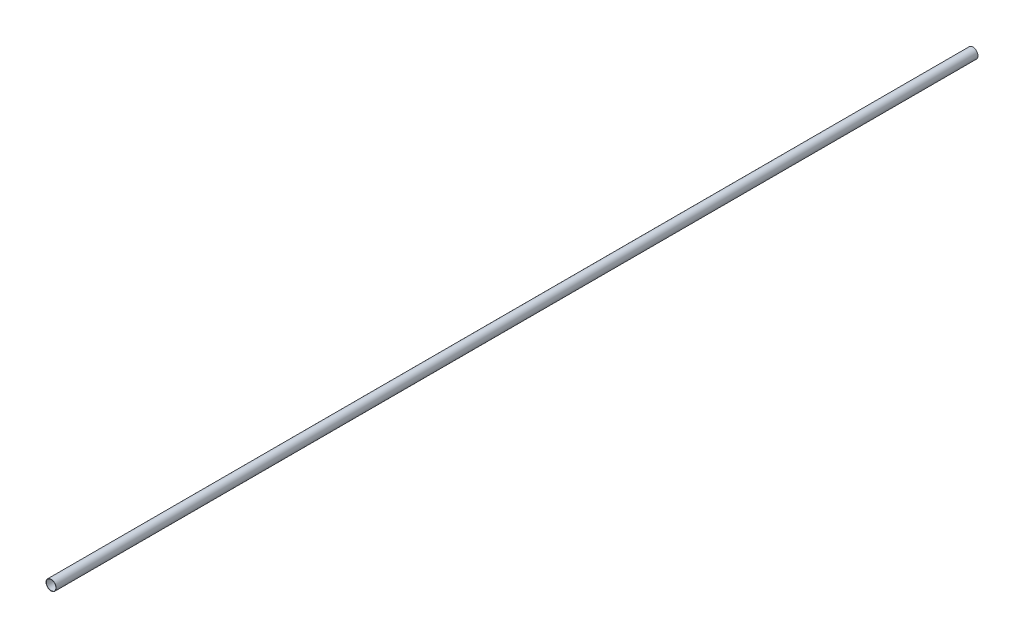
ISO-10303-21;
HEADER;
FILE_DESCRIPTION(('STEP AP214'),'2;1');
FILE_NAME('part.step','',(''),(''),'','','');
FILE_SCHEMA(('AUTOMOTIVE_DESIGN { 1 0 10303 214 1 1 1 1 }'));
ENDSEC;
DATA;
#1=APPLICATION_CONTEXT('core data for automotive mechanical design processes');
#2=APPLICATION_PROTOCOL_DEFINITION('international standard','automotive_design',2000,#1);
#3=PRODUCT_CONTEXT('',#1,'mechanical');
#4=PRODUCT('Part','Part','',(#3));
#5=PRODUCT_RELATED_PRODUCT_CATEGORY('part','',(#4));
#6=PRODUCT_DEFINITION_FORMATION('','',#4);
#7=PRODUCT_DEFINITION_CONTEXT('part definition',#1,'design');
#8=PRODUCT_DEFINITION('design','',#6,#7);
#9=PRODUCT_DEFINITION_SHAPE('','',#8);
#10=(LENGTH_UNIT() NAMED_UNIT(*) SI_UNIT(.MILLI.,.METRE.));
#11=(NAMED_UNIT(*) PLANE_ANGLE_UNIT() SI_UNIT($,.RADIAN.));
#12=(NAMED_UNIT(*) SI_UNIT($,.STERADIAN.) SOLID_ANGLE_UNIT());
#13=UNCERTAINTY_MEASURE_WITH_UNIT(LENGTH_MEASURE(1.E-05),#10,'distance_accuracy_value','');
#14=(GEOMETRIC_REPRESENTATION_CONTEXT(3) GLOBAL_UNCERTAINTY_ASSIGNED_CONTEXT((#13)) GLOBAL_UNIT_ASSIGNED_CONTEXT((#10,
#11,#12)) REPRESENTATION_CONTEXT('',''));
#15=CARTESIAN_POINT('',(0.,0.,0.));
#16=DIRECTION('',(0.,0.,1.));
#17=DIRECTION('',(1.,0.,0.));
#18=AXIS2_PLACEMENT_3D('',#15,#16,#17);
#19=CARTESIAN_POINT('',(-113.005374880156,-113.005374880156,825.5));
#20=DIRECTION('',(0.,0.,1.));
#21=DIRECTION('',(1.,0.,0.));
#22=AXIS2_PLACEMENT_3D('',#19,#20,#21);
#23=PLANE('',#22);
#24=CARTESIAN_POINT('',(-113.005374880156,-113.005374880156,825.5));
#25=DIRECTION('',(0.,0.,1.));
#26=DIRECTION('',(1.,0.,0.));
#27=AXIS2_PLACEMENT_3D('',#24,#25,#26);
#28=CIRCLE('',#27,4.572);
#29=CARTESIAN_POINT('',(-108.433374880156,-113.005374880156,825.5));
#30=VERTEX_POINT('',#29);
#31=EDGE_CURVE('E10',#30,#30,#28,.T.);
#32=ORIENTED_EDGE('',*,*,#31,.T.);
#33=EDGE_LOOP('',(#32));
#34=FACE_BOUND('',#33,.T.);
#35=CARTESIAN_POINT('',(-113.005374880156,-113.005374880156,825.5));
#36=DIRECTION('',(0.,0.,1.));
#37=DIRECTION('',(1.,0.,0.));
#38=AXIS2_PLACEMENT_3D('',#35,#36,#37);
#39=CIRCLE('',#38,4.318);
#40=CARTESIAN_POINT('',(-108.687374880156,-113.005374880156,825.5));
#41=VERTEX_POINT('',#40);
#42=EDGE_CURVE('E44',#41,#41,#39,.T.);
#43=ORIENTED_EDGE('',*,*,#42,.F.);
#44=EDGE_LOOP('',(#43));
#45=FACE_BOUND('',#44,.T.);
#46=ADVANCED_FACE('F33',(#34,#45),#23,.T.);
#47=CARTESIAN_POINT('',(-113.005374880156,-113.005374880156,0.));
#48=DIRECTION('',(0.,0.,1.));
#49=DIRECTION('',(1.,0.,0.));
#50=AXIS2_PLACEMENT_3D('',#47,#48,#49);
#51=PLANE('',#50);
#52=CARTESIAN_POINT('',(-113.005374880156,-113.005374880156,0.));
#53=DIRECTION('',(0.,0.,1.));
#54=DIRECTION('',(1.,0.,0.));
#55=AXIS2_PLACEMENT_3D('',#52,#53,#54);
#56=CIRCLE('',#55,4.572);
#57=CARTESIAN_POINT('',(-108.433374880156,-113.005374880156,0.));
#58=VERTEX_POINT('',#57);
#59=EDGE_CURVE('E37',#58,#58,#56,.T.);
#60=ORIENTED_EDGE('',*,*,#59,.F.);
#61=EDGE_LOOP('',(#60));
#62=FACE_BOUND('',#61,.T.);
#63=CARTESIAN_POINT('',(-113.005374880156,-113.005374880156,0.));
#64=DIRECTION('',(0.,0.,1.));
#65=DIRECTION('',(1.,0.,0.));
#66=AXIS2_PLACEMENT_3D('',#63,#64,#65);
#67=CIRCLE('',#66,4.318);
#68=CARTESIAN_POINT('',(-108.687374880156,-113.005374880156,0.));
#69=VERTEX_POINT('',#68);
#70=EDGE_CURVE('E46',#69,#69,#67,.T.);
#71=ORIENTED_EDGE('',*,*,#70,.T.);
#72=EDGE_LOOP('',(#71));
#73=FACE_BOUND('',#72,.T.);
#74=ADVANCED_FACE('F56',(#62,#73),#51,.F.);
#75=CARTESIAN_POINT('',(-113.005374880156,-113.005374880156,825.5));
#76=DIRECTION('',(0.,0.,-1.));
#77=DIRECTION('',(-1.,0.,0.));
#78=AXIS2_PLACEMENT_3D('',#75,#76,#77);
#79=CYLINDRICAL_SURFACE('',#78,4.572);
#80=ORIENTED_EDGE('',*,*,#31,.F.);
#81=EDGE_LOOP('',(#80));
#82=FACE_BOUND('',#81,.T.);
#83=ORIENTED_EDGE('',*,*,#59,.T.);
#84=EDGE_LOOP('',(#83));
#85=FACE_BOUND('',#84,.T.);
#86=ADVANCED_FACE('F35',(#82,#85),#79,.T.);
#87=CARTESIAN_POINT('',(-113.005374880156,-113.005374880156,825.5));
#88=DIRECTION('',(0.,0.,-1.));
#89=DIRECTION('',(-1.,0.,0.));
#90=AXIS2_PLACEMENT_3D('',#87,#88,#89);
#91=CYLINDRICAL_SURFACE('',#90,4.318);
#92=ORIENTED_EDGE('',*,*,#42,.T.);
#93=EDGE_LOOP('',(#92));
#94=FACE_BOUND('',#93,.T.);
#95=ORIENTED_EDGE('',*,*,#70,.F.);
#96=EDGE_LOOP('',(#95));
#97=FACE_BOUND('',#96,.T.);
#98=ADVANCED_FACE('F52',(#94,#97),#91,.F.);
#99=CLOSED_SHELL('',(#46,#74,#86,#98));
#100=MANIFOLD_SOLID_BREP('B2',#99);
#101=ADVANCED_BREP_SHAPE_REPRESENTATION('',(#18,#100),#14);
#102=SHAPE_DEFINITION_REPRESENTATION(#9,#101);
ENDSEC;
END-ISO-10303-21;
